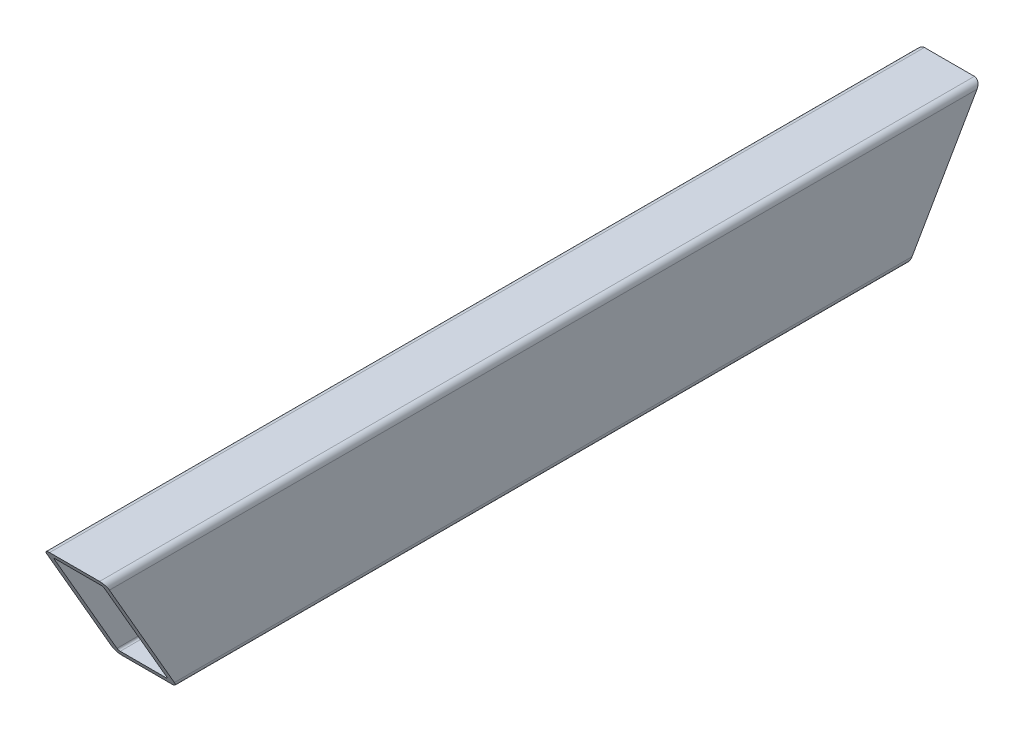
ISO-10303-21;
HEADER;
FILE_DESCRIPTION(('STEP AP214'),'2;1');
FILE_NAME('part.step','',(''),(''),'','','');
FILE_SCHEMA(('AUTOMOTIVE_DESIGN { 1 0 10303 214 1 1 1 1 }'));
ENDSEC;
DATA;
#1=APPLICATION_CONTEXT('core data for automotive mechanical design processes');
#2=APPLICATION_PROTOCOL_DEFINITION('international standard','automotive_design',2000,#1);
#3=PRODUCT_CONTEXT('',#1,'mechanical');
#4=PRODUCT('Part','Part','',(#3));
#5=PRODUCT_RELATED_PRODUCT_CATEGORY('part','',(#4));
#6=PRODUCT_DEFINITION_FORMATION('','',#4);
#7=PRODUCT_DEFINITION_CONTEXT('part definition',#1,'design');
#8=PRODUCT_DEFINITION('design','',#6,#7);
#9=PRODUCT_DEFINITION_SHAPE('','',#8);
#10=(LENGTH_UNIT() NAMED_UNIT(*) SI_UNIT(.MILLI.,.METRE.));
#11=(NAMED_UNIT(*) PLANE_ANGLE_UNIT() SI_UNIT($,.RADIAN.));
#12=(NAMED_UNIT(*) SI_UNIT($,.STERADIAN.) SOLID_ANGLE_UNIT());
#13=UNCERTAINTY_MEASURE_WITH_UNIT(LENGTH_MEASURE(1.E-05),#10,'distance_accuracy_value','');
#14=(GEOMETRIC_REPRESENTATION_CONTEXT(3) GLOBAL_UNCERTAINTY_ASSIGNED_CONTEXT((#13)) GLOBAL_UNIT_ASSIGNED_CONTEXT((#10,
#11,#12)) REPRESENTATION_CONTEXT('',''));
#15=CARTESIAN_POINT('',(0.,0.,0.));
#16=DIRECTION('',(0.,0.,1.));
#17=DIRECTION('',(1.,0.,0.));
#18=AXIS2_PLACEMENT_3D('',#15,#16,#17);
#19=CARTESIAN_POINT('',(-11.,-3.,-420.));
#20=DIRECTION('',(0.,1.,0.));
#21=DIRECTION('',(0.,0.,1.));
#22=AXIS2_PLACEMENT_3D('',#19,#20,#21);
#23=PLANE('',#22);
#24=DIRECTION('',(0.,0.,1.));
#25=VECTOR('',#24,1.);
#26=CARTESIAN_POINT('',(11.,-3.,-420.));
#27=LINE('',#26,#25);
#28=CARTESIAN_POINT('',(11.,-3.,-418.267949192431));
#29=VERTEX_POINT('',#28);
#30=CARTESIAN_POINT('',(11.,-3.,-1.73205080756889));
#31=VERTEX_POINT('',#30);
#32=EDGE_CURVE('E313',#29,#31,#27,.T.);
#33=ORIENTED_EDGE('',*,*,#32,.T.);
#34=DIRECTION('',(-1.,0.,0.));
#35=VECTOR('',#34,1.);
#36=CARTESIAN_POINT('',(-11.,-3.,-1.73205080756889));
#37=LINE('',#36,#35);
#38=CARTESIAN_POINT('',(-11.,-3.,-1.73205080756889));
#39=VERTEX_POINT('',#38);
#40=EDGE_CURVE('E11',#31,#39,#37,.T.);
#41=ORIENTED_EDGE('',*,*,#40,.T.);
#42=DIRECTION('',(0.,0.,1.));
#43=VECTOR('',#42,1.);
#44=CARTESIAN_POINT('',(-11.,-3.,-420.));
#45=LINE('',#44,#43);
#46=CARTESIAN_POINT('',(-11.,-3.,-418.267949192431));
#47=VERTEX_POINT('',#46);
#48=EDGE_CURVE('E338',#47,#39,#45,.T.);
#49=ORIENTED_EDGE('',*,*,#48,.F.);
#50=DIRECTION('',(1.,0.,0.));
#51=VECTOR('',#50,1.);
#52=CARTESIAN_POINT('',(-11.,-3.,-418.267949192431));
#53=LINE('',#52,#51);
#54=EDGE_CURVE('E48',#47,#29,#53,.T.);
#55=ORIENTED_EDGE('',*,*,#54,.T.);
#56=EDGE_LOOP('',(#33,#41,#49,#55));
#57=FACE_BOUND('',#56,.T.);
#58=ADVANCED_FACE('F39',(#57),#23,.F.);
#59=CARTESIAN_POINT('',(-11.,-4.,-420.));
#60=DIRECTION('',(0.,0.,1.));
#61=DIRECTION('',(1.,0.,0.));
#62=AXIS2_PLACEMENT_3D('',#59,#60,#61);
#63=CYLINDRICAL_SURFACE('',#62,1.);
#64=ORIENTED_EDGE('',*,*,#48,.T.);
#65=CARTESIAN_POINT('',(-11.,-4.,-2.30940107675853));
#66=DIRECTION('',(0.,0.500000000000004,-0.866025403784436));
#67=DIRECTION('',(0.,0.866025403784436,0.500000000000004));
#68=AXIS2_PLACEMENT_3D('',#65,#66,#67);
#69=ELLIPSE('',#68,1.15470053837926,1.);
#70=CARTESIAN_POINT('',(-12.,-4.,-2.30940107675853));
#71=VERTEX_POINT('',#70);
#72=EDGE_CURVE('E63',#39,#71,#69,.F.);
#73=ORIENTED_EDGE('',*,*,#72,.T.);
#74=DIRECTION('',(0.,0.,1.));
#75=VECTOR('',#74,1.);
#76=CARTESIAN_POINT('',(-12.,-4.,-420.));
#77=LINE('',#76,#75);
#78=CARTESIAN_POINT('',(-12.,-4.,-417.690598923242));
#79=VERTEX_POINT('',#78);
#80=EDGE_CURVE('E334',#79,#71,#77,.T.);
#81=ORIENTED_EDGE('',*,*,#80,.F.);
#82=CARTESIAN_POINT('',(-11.,-4.,-417.690598923242));
#83=DIRECTION('',(0.,0.499999999999995,0.866025403784442));
#84=DIRECTION('',(0.,-0.866025403784442,0.499999999999995));
#85=AXIS2_PLACEMENT_3D('',#82,#83,#84);
#86=ELLIPSE('',#85,1.15470053837925,1.);
#87=EDGE_CURVE('E227',#79,#47,#86,.F.);
#88=ORIENTED_EDGE('',*,*,#87,.T.);
#89=EDGE_LOOP('',(#64,#73,#81,#88));
#90=FACE_BOUND('',#89,.T.);
#91=ADVANCED_FACE('F363',(#90),#63,.F.);
#92=CARTESIAN_POINT('',(-12.,-56.,-420.));
#93=DIRECTION('',(-1.,0.,0.));
#94=DIRECTION('',(0.,-1.,0.));
#95=AXIS2_PLACEMENT_3D('',#92,#93,#94);
#96=PLANE('',#95);
#97=ORIENTED_EDGE('',*,*,#80,.T.);
#98=DIRECTION('',(0.,-0.866025403784436,-0.500000000000004));
#99=VECTOR('',#98,1.);
#100=CARTESIAN_POINT('',(-11.9999999999999,-223.865334794733,-129.248711305966));
#101=LINE('',#100,#99);
#102=CARTESIAN_POINT('',(-12.,-56.,-32.3316150746194));
#103=VERTEX_POINT('',#102);
#104=EDGE_CURVE('E278',#71,#103,#101,.T.);
#105=ORIENTED_EDGE('',*,*,#104,.T.);
#106=DIRECTION('',(0.,0.,1.));
#107=VECTOR('',#106,1.);
#108=CARTESIAN_POINT('',(-12.,-56.,-420.));
#109=LINE('',#108,#107);
#110=CARTESIAN_POINT('',(-12.,-56.,-387.668384925381));
#111=VERTEX_POINT('',#110);
#112=EDGE_CURVE('E330',#111,#103,#109,.T.);
#113=ORIENTED_EDGE('',*,*,#112,.F.);
#114=DIRECTION('',(0.,0.866025403784442,-0.499999999999995));
#115=VECTOR('',#114,1.);
#116=CARTESIAN_POINT('',(-12.,-42.0000000000003,-395.751288694036));
#117=LINE('',#116,#115);
#118=EDGE_CURVE('E233',#111,#79,#117,.T.);
#119=ORIENTED_EDGE('',*,*,#118,.T.);
#120=EDGE_LOOP('',(#97,#105,#113,#119));
#121=FACE_BOUND('',#120,.T.);
#122=ADVANCED_FACE('F360',(#121),#96,.F.);
#123=CARTESIAN_POINT('',(-11.,-56.,-420.));
#124=DIRECTION('',(0.,0.,1.));
#125=DIRECTION('',(1.,0.,0.));
#126=AXIS2_PLACEMENT_3D('',#123,#124,#125);
#127=CYLINDRICAL_SURFACE('',#126,1.);
#128=ORIENTED_EDGE('',*,*,#112,.T.);
#129=CARTESIAN_POINT('',(-11.,-56.,-32.3316150746194));
#130=DIRECTION('',(0.,0.500000000000004,-0.866025403784436));
#131=DIRECTION('',(0.,0.866025403784436,0.500000000000004));
#132=AXIS2_PLACEMENT_3D('',#129,#130,#131);
#133=ELLIPSE('',#132,1.15470053837926,1.);
#134=CARTESIAN_POINT('',(-11.,-57.,-32.9089653438091));
#135=VERTEX_POINT('',#134);
#136=EDGE_CURVE('E282',#103,#135,#133,.F.);
#137=ORIENTED_EDGE('',*,*,#136,.T.);
#138=DIRECTION('',(0.,0.,1.));
#139=VECTOR('',#138,1.);
#140=CARTESIAN_POINT('',(-11.,-57.,-420.));
#141=LINE('',#140,#139);
#142=CARTESIAN_POINT('',(-11.,-57.,-387.091034656192));
#143=VERTEX_POINT('',#142);
#144=EDGE_CURVE('E326',#143,#135,#141,.T.);
#145=ORIENTED_EDGE('',*,*,#144,.F.);
#146=CARTESIAN_POINT('',(-11.,-56.,-387.668384925381));
#147=DIRECTION('',(0.,0.499999999999995,0.866025403784442));
#148=DIRECTION('',(0.,-0.866025403784442,0.499999999999995));
#149=AXIS2_PLACEMENT_3D('',#146,#147,#148);
#150=ELLIPSE('',#149,1.15470053837925,1.);
#151=EDGE_CURVE('E251',#143,#111,#150,.F.);
#152=ORIENTED_EDGE('',*,*,#151,.T.);
#153=EDGE_LOOP('',(#128,#137,#145,#152));
#154=FACE_BOUND('',#153,.T.);
#155=ADVANCED_FACE('F357',(#154),#127,.F.);
#156=CARTESIAN_POINT('',(-11.,-57.,-420.));
#157=DIRECTION('',(0.,-1.,0.));
#158=DIRECTION('',(0.,0.,-1.));
#159=AXIS2_PLACEMENT_3D('',#156,#157,#158);
#160=PLANE('',#159);
#161=ORIENTED_EDGE('',*,*,#144,.T.);
#162=DIRECTION('',(1.,0.,0.));
#163=VECTOR('',#162,1.);
#164=CARTESIAN_POINT('',(-11.,-57.,-32.9089653438091));
#165=LINE('',#164,#163);
#166=CARTESIAN_POINT('',(11.,-57.,-32.9089653438091));
#167=VERTEX_POINT('',#166);
#168=EDGE_CURVE('E286',#135,#167,#165,.T.);
#169=ORIENTED_EDGE('',*,*,#168,.T.);
#170=DIRECTION('',(0.,0.,1.));
#171=VECTOR('',#170,1.);
#172=CARTESIAN_POINT('',(11.,-57.,-420.));
#173=LINE('',#172,#171);
#174=CARTESIAN_POINT('',(11.,-57.,-387.091034656192));
#175=VERTEX_POINT('',#174);
#176=EDGE_CURVE('E322',#175,#167,#173,.T.);
#177=ORIENTED_EDGE('',*,*,#176,.F.);
#178=DIRECTION('',(-1.,0.,0.));
#179=VECTOR('',#178,1.);
#180=CARTESIAN_POINT('',(-11.,-57.,-387.091034656192));
#181=LINE('',#180,#179);
#182=EDGE_CURVE('E255',#175,#143,#181,.T.);
#183=ORIENTED_EDGE('',*,*,#182,.T.);
#184=EDGE_LOOP('',(#161,#169,#177,#183));
#185=FACE_BOUND('',#184,.T.);
#186=ADVANCED_FACE('F354',(#185),#160,.F.);
#187=CARTESIAN_POINT('',(11.,-56.,-420.));
#188=DIRECTION('',(0.,0.,1.));
#189=DIRECTION('',(1.,0.,0.));
#190=AXIS2_PLACEMENT_3D('',#187,#188,#189);
#191=CYLINDRICAL_SURFACE('',#190,1.);
#192=ORIENTED_EDGE('',*,*,#176,.T.);
#193=CARTESIAN_POINT('',(11.,-56.,-32.3316150746194));
#194=DIRECTION('',(0.,0.500000000000004,-0.866025403784436));
#195=DIRECTION('',(0.,0.866025403784436,0.500000000000004));
#196=AXIS2_PLACEMENT_3D('',#193,#194,#195);
#197=ELLIPSE('',#196,1.15470053837926,1.);
#198=CARTESIAN_POINT('',(12.,-56.,-32.3316150746194));
#199=VERTEX_POINT('',#198);
#200=EDGE_CURVE('E290',#167,#199,#197,.F.);
#201=ORIENTED_EDGE('',*,*,#200,.T.);
#202=DIRECTION('',(0.,0.,1.));
#203=VECTOR('',#202,1.);
#204=CARTESIAN_POINT('',(12.,-56.,-420.));
#205=LINE('',#204,#203);
#206=CARTESIAN_POINT('',(12.,-56.,-387.668384925381));
#207=VERTEX_POINT('',#206);
#208=EDGE_CURVE('E318',#207,#199,#205,.T.);
#209=ORIENTED_EDGE('',*,*,#208,.F.);
#210=CARTESIAN_POINT('',(11.,-56.,-387.668384925381));
#211=DIRECTION('',(0.,0.499999999999995,0.866025403784442));
#212=DIRECTION('',(0.,-0.866025403784442,0.499999999999995));
#213=AXIS2_PLACEMENT_3D('',#210,#211,#212);
#214=ELLIPSE('',#213,1.15470053837925,1.);
#215=EDGE_CURVE('E259',#207,#175,#214,.F.);
#216=ORIENTED_EDGE('',*,*,#215,.T.);
#217=EDGE_LOOP('',(#192,#201,#209,#216));
#218=FACE_BOUND('',#217,.T.);
#219=ADVANCED_FACE('F351',(#218),#191,.F.);
#220=CARTESIAN_POINT('',(12.,-56.,-420.));
#221=DIRECTION('',(1.,0.,0.));
#222=DIRECTION('',(0.,1.,0.));
#223=AXIS2_PLACEMENT_3D('',#220,#221,#222);
#224=PLANE('',#223);
#225=ORIENTED_EDGE('',*,*,#208,.T.);
#226=DIRECTION('',(0.,0.866025403784436,0.500000000000004));
#227=VECTOR('',#226,1.);
#228=CARTESIAN_POINT('',(12.,-223.865334794733,-129.248711305966));
#229=LINE('',#228,#227);
#230=CARTESIAN_POINT('',(12.,-4.,-2.30940107675853));
#231=VERTEX_POINT('',#230);
#232=EDGE_CURVE('E294',#199,#231,#229,.T.);
#233=ORIENTED_EDGE('',*,*,#232,.T.);
#234=DIRECTION('',(0.,0.,1.));
#235=VECTOR('',#234,1.);
#236=CARTESIAN_POINT('',(12.,-4.,-420.));
#237=LINE('',#236,#235);
#238=CARTESIAN_POINT('',(12.,-4.,-417.690598923242));
#239=VERTEX_POINT('',#238);
#240=EDGE_CURVE('E314',#239,#231,#237,.T.);
#241=ORIENTED_EDGE('',*,*,#240,.F.);
#242=DIRECTION('',(0.,-0.866025403784442,0.499999999999995));
#243=VECTOR('',#242,1.);
#244=CARTESIAN_POINT('',(12.,-42.0000000000003,-395.751288694036));
#245=LINE('',#244,#243);
#246=EDGE_CURVE('E263',#239,#207,#245,.T.);
#247=ORIENTED_EDGE('',*,*,#246,.T.);
#248=EDGE_LOOP('',(#225,#233,#241,#247));
#249=FACE_BOUND('',#248,.T.);
#250=ADVANCED_FACE('F348',(#249),#224,.F.);
#251=CARTESIAN_POINT('',(11.,-4.,-420.));
#252=DIRECTION('',(0.,0.,1.));
#253=DIRECTION('',(1.,0.,0.));
#254=AXIS2_PLACEMENT_3D('',#251,#252,#253);
#255=CYLINDRICAL_SURFACE('',#254,1.);
#256=ORIENTED_EDGE('',*,*,#240,.T.);
#257=CARTESIAN_POINT('',(11.,-4.,-2.30940107675853));
#258=DIRECTION('',(0.,0.500000000000004,-0.866025403784436));
#259=DIRECTION('',(0.,0.866025403784436,0.500000000000004));
#260=AXIS2_PLACEMENT_3D('',#257,#258,#259);
#261=ELLIPSE('',#260,1.15470053837926,1.);
#262=EDGE_CURVE('E298',#231,#31,#261,.F.);
#263=ORIENTED_EDGE('',*,*,#262,.T.);
#264=ORIENTED_EDGE('',*,*,#32,.F.);
#265=CARTESIAN_POINT('',(11.,-4.,-417.690598923242));
#266=DIRECTION('',(0.,0.499999999999995,0.866025403784442));
#267=DIRECTION('',(0.,-0.866025403784442,0.499999999999995));
#268=AXIS2_PLACEMENT_3D('',#265,#266,#267);
#269=ELLIPSE('',#268,1.15470053837925,1.);
#270=EDGE_CURVE('E55',#29,#239,#269,.F.);
#271=ORIENTED_EDGE('',*,*,#270,.T.);
#272=EDGE_LOOP('',(#256,#263,#264,#271));
#273=FACE_BOUND('',#272,.T.);
#274=ADVANCED_FACE('F344',(#273),#255,.F.);
#275=CARTESIAN_POINT('',(-84.2820323027553,0.,-420.));
#276=DIRECTION('',(0.,0.499999999999995,0.866025403784442));
#277=DIRECTION('',(0.,-0.866025403784442,0.499999999999995));
#278=AXIS2_PLACEMENT_3D('',#275,#276,#277);
#279=PLANE('',#278);
#280=CARTESIAN_POINT('',(12.,-2.99999999999999,-418.267949192431));
#281=DIRECTION('',(0.,0.499999999999995,0.866025403784442));
#282=DIRECTION('',(0.,-0.866025403784442,0.499999999999995));
#283=AXIS2_PLACEMENT_3D('',#280,#281,#282);
#284=ELLIPSE('',#283,3.46410161513774,2.99999999999999);
#285=CARTESIAN_POINT('',(12.,0.,-420.));
#286=VERTEX_POINT('',#285);
#287=CARTESIAN_POINT('',(15.,-3.00000000000001,-418.267949192431));
#288=VERTEX_POINT('',#287);
#289=EDGE_CURVE('E154',#286,#288,#284,.F.);
#290=ORIENTED_EDGE('',*,*,#289,.T.);
#291=DIRECTION('',(0.,-0.866025403784442,0.499999999999995));
#292=VECTOR('',#291,1.);
#293=CARTESIAN_POINT('',(15.,0.,-420.));
#294=LINE('',#293,#292);
#295=CARTESIAN_POINT('',(15.,-57.,-387.091034656192));
#296=VERTEX_POINT('',#295);
#297=EDGE_CURVE('E239',#288,#296,#294,.T.);
#298=ORIENTED_EDGE('',*,*,#297,.T.);
#299=CARTESIAN_POINT('',(12.,-57.,-387.091034656192));
#300=DIRECTION('',(0.,0.499999999999995,0.866025403784442));
#301=DIRECTION('',(0.,-0.866025403784442,0.499999999999995));
#302=AXIS2_PLACEMENT_3D('',#299,#300,#301);
#303=ELLIPSE('',#302,3.46410161513774,3.);
#304=CARTESIAN_POINT('',(12.,-60.,-385.358983848623));
#305=VERTEX_POINT('',#304);
#306=EDGE_CURVE('E174',#296,#305,#303,.F.);
#307=ORIENTED_EDGE('',*,*,#306,.T.);
#308=DIRECTION('',(1.,0.,0.));
#309=VECTOR('',#308,1.);
#310=CARTESIAN_POINT('',(-84.2820323027553,-60.,-385.358983848623));
#311=LINE('',#310,#309);
#312=CARTESIAN_POINT('',(-12.,-60.,-385.358983848623));
#313=VERTEX_POINT('',#312);
#314=EDGE_CURVE('E244',#313,#305,#311,.T.);
#315=ORIENTED_EDGE('',*,*,#314,.F.);
#316=CARTESIAN_POINT('',(-12.,-57.,-387.091034656192));
#317=DIRECTION('',(0.,0.499999999999995,0.866025403784442));
#318=DIRECTION('',(0.,-0.866025403784442,0.499999999999995));
#319=AXIS2_PLACEMENT_3D('',#316,#317,#318);
#320=ELLIPSE('',#319,3.46410161513774,3.);
#321=CARTESIAN_POINT('',(-15.,-57.,-387.091034656192));
#322=VERTEX_POINT('',#321);
#323=EDGE_CURVE('E271',#313,#322,#320,.F.);
#324=ORIENTED_EDGE('',*,*,#323,.T.);
#325=DIRECTION('',(0.,-0.866025403784442,0.499999999999995));
#326=VECTOR('',#325,1.);
#327=CARTESIAN_POINT('',(-15.,0.,-420.));
#328=LINE('',#327,#326);
#329=CARTESIAN_POINT('',(-15.,-2.99999999999999,-418.267949192431));
#330=VERTEX_POINT('',#329);
#331=EDGE_CURVE('E221',#330,#322,#328,.T.);
#332=ORIENTED_EDGE('',*,*,#331,.F.);
#333=CARTESIAN_POINT('',(-12.,-2.99999999999999,-418.267949192431));
#334=DIRECTION('',(0.,0.499999999999995,0.866025403784442));
#335=DIRECTION('',(0.,-0.866025403784442,0.499999999999995));
#336=AXIS2_PLACEMENT_3D('',#333,#334,#335);
#337=ELLIPSE('',#336,3.46410161513774,2.99999999999999);
#338=CARTESIAN_POINT('',(-12.,0.,-420.));
#339=VERTEX_POINT('',#338);
#340=EDGE_CURVE('E157',#330,#339,#337,.F.);
#341=ORIENTED_EDGE('',*,*,#340,.T.);
#342=DIRECTION('',(-1.,0.,0.));
#343=VECTOR('',#342,1.);
#344=CARTESIAN_POINT('',(-12.,0.,-420.));
#345=LINE('',#344,#343);
#346=EDGE_CURVE('E151',#286,#339,#345,.T.);
#347=ORIENTED_EDGE('',*,*,#346,.F.);
#348=EDGE_LOOP('',(#290,#298,#307,#315,#324,#332,#341,#347));
#349=FACE_BOUND('',#348,.T.);
#350=ORIENTED_EDGE('',*,*,#54,.F.);
#351=ORIENTED_EDGE('',*,*,#87,.F.);
#352=ORIENTED_EDGE('',*,*,#118,.F.);
#353=ORIENTED_EDGE('',*,*,#151,.F.);
#354=ORIENTED_EDGE('',*,*,#182,.F.);
#355=ORIENTED_EDGE('',*,*,#215,.F.);
#356=ORIENTED_EDGE('',*,*,#246,.F.);
#357=ORIENTED_EDGE('',*,*,#270,.F.);
#358=EDGE_LOOP('',(#350,#351,#352,#353,#354,#355,#356,#357));
#359=FACE_BOUND('',#358,.T.);
#360=ADVANCED_FACE('F153',(#349,#359),#279,.F.);
#361=CARTESIAN_POINT('',(-84.2820323027553,-60.,-34.6410161513779));
#362=DIRECTION('',(0.,0.500000000000004,-0.866025403784436));
#363=DIRECTION('',(0.,0.866025403784436,0.500000000000004));
#364=AXIS2_PLACEMENT_3D('',#361,#362,#363);
#365=PLANE('',#364);
#366=CARTESIAN_POINT('',(12.,-2.99999999999999,-1.73205080756889));
#367=DIRECTION('',(0.,0.500000000000004,-0.866025403784436));
#368=DIRECTION('',(0.,0.866025403784436,0.500000000000004));
#369=AXIS2_PLACEMENT_3D('',#366,#367,#368);
#370=ELLIPSE('',#369,3.46410161513776,2.99999999999999);
#371=CARTESIAN_POINT('',(15.,-3.00000000000003,-1.73205080756891));
#372=VERTEX_POINT('',#371);
#373=CARTESIAN_POINT('',(12.,0.,0.));
#374=VERTEX_POINT('',#373);
#375=EDGE_CURVE('E310',#372,#374,#370,.F.);
#376=ORIENTED_EDGE('',*,*,#375,.T.);
#377=DIRECTION('',(-1.,0.,0.));
#378=VECTOR('',#377,1.);
#379=CARTESIAN_POINT('',(-12.,0.,0.));
#380=LINE('',#379,#378);
#381=CARTESIAN_POINT('',(-12.,0.,0.));
#382=VERTEX_POINT('',#381);
#383=EDGE_CURVE('E164',#374,#382,#380,.T.);
#384=ORIENTED_EDGE('',*,*,#383,.T.);
#385=CARTESIAN_POINT('',(-12.,-2.99999999999999,-1.73205080756889));
#386=DIRECTION('',(0.,0.500000000000004,-0.866025403784436));
#387=DIRECTION('',(0.,0.866025403784436,0.500000000000004));
#388=AXIS2_PLACEMENT_3D('',#385,#386,#387);
#389=ELLIPSE('',#388,3.46410161513776,2.99999999999999);
#390=CARTESIAN_POINT('',(-15.,-2.99999999999999,-1.73205080756889));
#391=VERTEX_POINT('',#390);
#392=EDGE_CURVE('E216',#382,#391,#389,.F.);
#393=ORIENTED_EDGE('',*,*,#392,.T.);
#394=DIRECTION('',(0.,0.866025403784436,0.500000000000004));
#395=VECTOR('',#394,1.);
#396=CARTESIAN_POINT('',(-15.,-60.,-34.6410161513779));
#397=LINE('',#396,#395);
#398=CARTESIAN_POINT('',(-15.,-57.,-32.908965343809));
#399=VERTEX_POINT('',#398);
#400=EDGE_CURVE('E223',#399,#391,#397,.T.);
#401=ORIENTED_EDGE('',*,*,#400,.F.);
#402=CARTESIAN_POINT('',(-12.,-57.,-32.9089653438091));
#403=DIRECTION('',(0.,0.500000000000004,-0.866025403784436));
#404=DIRECTION('',(0.,0.866025403784436,0.500000000000004));
#405=AXIS2_PLACEMENT_3D('',#402,#403,#404);
#406=ELLIPSE('',#405,3.46410161513776,3.);
#407=CARTESIAN_POINT('',(-12.,-60.,-34.6410161513779));
#408=VERTEX_POINT('',#407);
#409=EDGE_CURVE('E304',#399,#408,#406,.F.);
#410=ORIENTED_EDGE('',*,*,#409,.T.);
#411=DIRECTION('',(1.,0.,0.));
#412=VECTOR('',#411,1.);
#413=CARTESIAN_POINT('',(-84.2820323027553,-60.,-34.6410161513779));
#414=LINE('',#413,#412);
#415=CARTESIAN_POINT('',(12.,-60.,-34.6410161513779));
#416=VERTEX_POINT('',#415);
#417=EDGE_CURVE('E228',#408,#416,#414,.T.);
#418=ORIENTED_EDGE('',*,*,#417,.T.);
#419=CARTESIAN_POINT('',(12.,-57.,-32.9089653438091));
#420=DIRECTION('',(0.,0.500000000000004,-0.866025403784436));
#421=DIRECTION('',(0.,0.866025403784436,0.500000000000004));
#422=AXIS2_PLACEMENT_3D('',#419,#420,#421);
#423=ELLIPSE('',#422,3.46410161513776,3.);
#424=CARTESIAN_POINT('',(15.,-57.,-32.9089653438091));
#425=VERTEX_POINT('',#424);
#426=EDGE_CURVE('E307',#416,#425,#423,.F.);
#427=ORIENTED_EDGE('',*,*,#426,.T.);
#428=DIRECTION('',(0.,0.866025403784436,0.500000000000004));
#429=VECTOR('',#428,1.);
#430=CARTESIAN_POINT('',(15.,-60.,-34.6410161513779));
#431=LINE('',#430,#429);
#432=EDGE_CURVE('E235',#425,#372,#431,.T.);
#433=ORIENTED_EDGE('',*,*,#432,.T.);
#434=EDGE_LOOP('',(#376,#384,#393,#401,#410,#418,#427,#433));
#435=FACE_BOUND('',#434,.T.);
#436=ORIENTED_EDGE('',*,*,#232,.F.);
#437=ORIENTED_EDGE('',*,*,#200,.F.);
#438=ORIENTED_EDGE('',*,*,#168,.F.);
#439=ORIENTED_EDGE('',*,*,#136,.F.);
#440=ORIENTED_EDGE('',*,*,#104,.F.);
#441=ORIENTED_EDGE('',*,*,#72,.F.);
#442=ORIENTED_EDGE('',*,*,#40,.F.);
#443=ORIENTED_EDGE('',*,*,#262,.F.);
#444=EDGE_LOOP('',(#436,#437,#438,#439,#440,#441,#442,#443));
#445=FACE_BOUND('',#444,.T.);
#446=ADVANCED_FACE('F346',(#435,#445),#365,.F.);
#447=CARTESIAN_POINT('',(12.,-2.99999999999999,-420.));
#448=DIRECTION('',(0.,0.,1.));
#449=DIRECTION('',(1.,0.,0.));
#450=AXIS2_PLACEMENT_3D('',#447,#448,#449);
#451=CYLINDRICAL_SURFACE('',#450,2.99999999999999);
#452=ORIENTED_EDGE('',*,*,#375,.F.);
#453=DIRECTION('',(0.,0.,1.));
#454=VECTOR('',#453,1.);
#455=CARTESIAN_POINT('',(15.,-2.99999999999999,-420.));
#456=LINE('',#455,#454);
#457=EDGE_CURVE('E172',#288,#372,#456,.T.);
#458=ORIENTED_EDGE('',*,*,#457,.F.);
#459=ORIENTED_EDGE('',*,*,#289,.F.);
#460=DIRECTION('',(0.,0.,1.));
#461=VECTOR('',#460,1.);
#462=CARTESIAN_POINT('',(12.,0.,-420.));
#463=LINE('',#462,#461);
#464=EDGE_CURVE('E163',#286,#374,#463,.T.);
#465=ORIENTED_EDGE('',*,*,#464,.T.);
#466=EDGE_LOOP('',(#452,#458,#459,#465));
#467=FACE_BOUND('',#466,.T.);
#468=ADVANCED_FACE('F41',(#467),#451,.T.);
#469=CARTESIAN_POINT('',(15.,-57.,-420.));
#470=DIRECTION('',(1.,0.,0.));
#471=DIRECTION('',(0.,0.,-1.));
#472=AXIS2_PLACEMENT_3D('',#469,#470,#471);
#473=PLANE('',#472);
#474=ORIENTED_EDGE('',*,*,#432,.F.);
#475=DIRECTION('',(0.,0.,1.));
#476=VECTOR('',#475,1.);
#477=CARTESIAN_POINT('',(15.,-57.,-420.));
#478=LINE('',#477,#476);
#479=EDGE_CURVE('E190',#296,#425,#478,.T.);
#480=ORIENTED_EDGE('',*,*,#479,.F.);
#481=ORIENTED_EDGE('',*,*,#297,.F.);
#482=ORIENTED_EDGE('',*,*,#457,.T.);
#483=EDGE_LOOP('',(#474,#480,#481,#482));
#484=FACE_BOUND('',#483,.T.);
#485=ADVANCED_FACE('F381',(#484),#473,.T.);
#486=CARTESIAN_POINT('',(12.,-57.,-420.));
#487=DIRECTION('',(0.,0.,1.));
#488=DIRECTION('',(1.,0.,0.));
#489=AXIS2_PLACEMENT_3D('',#486,#487,#488);
#490=CYLINDRICAL_SURFACE('',#489,3.);
#491=ORIENTED_EDGE('',*,*,#426,.F.);
#492=DIRECTION('',(0.,0.,1.));
#493=VECTOR('',#492,1.);
#494=CARTESIAN_POINT('',(12.,-60.,-420.));
#495=LINE('',#494,#493);
#496=EDGE_CURVE('E196',#305,#416,#495,.T.);
#497=ORIENTED_EDGE('',*,*,#496,.F.);
#498=ORIENTED_EDGE('',*,*,#306,.F.);
#499=ORIENTED_EDGE('',*,*,#479,.T.);
#500=EDGE_LOOP('',(#491,#497,#498,#499));
#501=FACE_BOUND('',#500,.T.);
#502=ADVANCED_FACE('F384',(#501),#490,.T.);
#503=CARTESIAN_POINT('',(-12.,-60.,-420.));
#504=DIRECTION('',(0.,-1.,0.));
#505=DIRECTION('',(0.,0.,-1.));
#506=AXIS2_PLACEMENT_3D('',#503,#504,#505);
#507=PLANE('',#506);
#508=ORIENTED_EDGE('',*,*,#417,.F.);
#509=DIRECTION('',(0.,0.,1.));
#510=VECTOR('',#509,1.);
#511=CARTESIAN_POINT('',(-12.,-60.,-420.));
#512=LINE('',#511,#510);
#513=EDGE_CURVE('E203',#313,#408,#512,.T.);
#514=ORIENTED_EDGE('',*,*,#513,.F.);
#515=ORIENTED_EDGE('',*,*,#314,.T.);
#516=ORIENTED_EDGE('',*,*,#496,.T.);
#517=EDGE_LOOP('',(#508,#514,#515,#516));
#518=FACE_BOUND('',#517,.T.);
#519=ADVANCED_FACE('F387',(#518),#507,.T.);
#520=CARTESIAN_POINT('',(-12.,-57.,-420.));
#521=DIRECTION('',(0.,0.,1.));
#522=DIRECTION('',(1.,0.,0.));
#523=AXIS2_PLACEMENT_3D('',#520,#521,#522);
#524=CYLINDRICAL_SURFACE('',#523,3.);
#525=ORIENTED_EDGE('',*,*,#409,.F.);
#526=DIRECTION('',(0.,0.,1.));
#527=VECTOR('',#526,1.);
#528=CARTESIAN_POINT('',(-15.,-57.,-420.));
#529=LINE('',#528,#527);
#530=EDGE_CURVE('E207',#322,#399,#529,.T.);
#531=ORIENTED_EDGE('',*,*,#530,.F.);
#532=ORIENTED_EDGE('',*,*,#323,.F.);
#533=ORIENTED_EDGE('',*,*,#513,.T.);
#534=EDGE_LOOP('',(#525,#531,#532,#533));
#535=FACE_BOUND('',#534,.T.);
#536=ADVANCED_FACE('F391',(#535),#524,.T.);
#537=CARTESIAN_POINT('',(-15.,-57.,-420.));
#538=DIRECTION('',(-1.,0.,0.));
#539=DIRECTION('',(0.,-1.,0.));
#540=AXIS2_PLACEMENT_3D('',#537,#538,#539);
#541=PLANE('',#540);
#542=ORIENTED_EDGE('',*,*,#400,.T.);
#543=DIRECTION('',(0.,0.,1.));
#544=VECTOR('',#543,1.);
#545=CARTESIAN_POINT('',(-15.,-2.99999999999999,-420.));
#546=LINE('',#545,#544);
#547=EDGE_CURVE('E181',#330,#391,#546,.T.);
#548=ORIENTED_EDGE('',*,*,#547,.F.);
#549=ORIENTED_EDGE('',*,*,#331,.T.);
#550=ORIENTED_EDGE('',*,*,#530,.T.);
#551=EDGE_LOOP('',(#542,#548,#549,#550));
#552=FACE_BOUND('',#551,.T.);
#553=ADVANCED_FACE('F220',(#552),#541,.T.);
#554=CARTESIAN_POINT('',(-12.,-2.99999999999999,-420.));
#555=DIRECTION('',(0.,0.,1.));
#556=DIRECTION('',(1.,0.,0.));
#557=AXIS2_PLACEMENT_3D('',#554,#555,#556);
#558=CYLINDRICAL_SURFACE('',#557,2.99999999999999);
#559=ORIENTED_EDGE('',*,*,#392,.F.);
#560=DIRECTION('',(0.,0.,1.));
#561=VECTOR('',#560,1.);
#562=CARTESIAN_POINT('',(-12.,0.,-420.));
#563=LINE('',#562,#561);
#564=EDGE_CURVE('E178',#339,#382,#563,.T.);
#565=ORIENTED_EDGE('',*,*,#564,.F.);
#566=ORIENTED_EDGE('',*,*,#340,.F.);
#567=ORIENTED_EDGE('',*,*,#547,.T.);
#568=EDGE_LOOP('',(#559,#565,#566,#567));
#569=FACE_BOUND('',#568,.T.);
#570=ADVANCED_FACE('F215',(#569),#558,.T.);
#571=CARTESIAN_POINT('',(-12.,0.,-420.));
#572=DIRECTION('',(0.,1.,0.));
#573=DIRECTION('',(0.,0.,1.));
#574=AXIS2_PLACEMENT_3D('',#571,#572,#573);
#575=PLANE('',#574);
#576=ORIENTED_EDGE('',*,*,#383,.F.);
#577=ORIENTED_EDGE('',*,*,#464,.F.);
#578=ORIENTED_EDGE('',*,*,#346,.T.);
#579=ORIENTED_EDGE('',*,*,#564,.T.);
#580=EDGE_LOOP('',(#576,#577,#578,#579));
#581=FACE_BOUND('',#580,.T.);
#582=ADVANCED_FACE('F176',(#581),#575,.T.);
#583=CLOSED_SHELL('',(#58,#91,#122,#155,#186,#219,#250,#274,#360,#446,#468,#485,#502,#519,#536,
#553,#570,#582));
#584=MANIFOLD_SOLID_BREP('B2',#583);
#585=ADVANCED_BREP_SHAPE_REPRESENTATION('',(#18,#584),#14);
#586=SHAPE_DEFINITION_REPRESENTATION(#9,#585);
ENDSEC;
END-ISO-10303-21;
